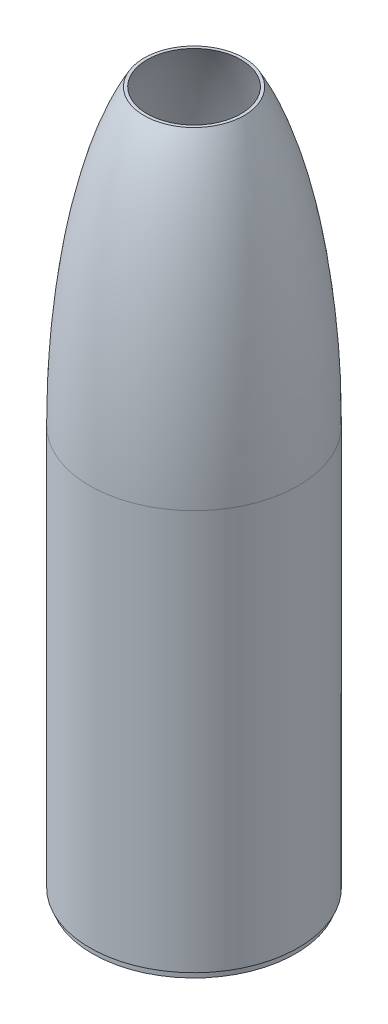
ISO-10303-21;
HEADER;
FILE_DESCRIPTION(('STEP AP214'),'2;1');
FILE_NAME('part.step','',(''),(''),'','','');
FILE_SCHEMA(('AUTOMOTIVE_DESIGN { 1 0 10303 214 1 1 1 1 }'));
ENDSEC;
DATA;
#1=APPLICATION_CONTEXT('core data for automotive mechanical design processes');
#2=APPLICATION_PROTOCOL_DEFINITION('international standard','automotive_design',2000,#1);
#3=PRODUCT_CONTEXT('',#1,'mechanical');
#4=PRODUCT('Part','Part','',(#3));
#5=PRODUCT_RELATED_PRODUCT_CATEGORY('part','',(#4));
#6=PRODUCT_DEFINITION_FORMATION('','',#4);
#7=PRODUCT_DEFINITION_CONTEXT('part definition',#1,'design');
#8=PRODUCT_DEFINITION('design','',#6,#7);
#9=PRODUCT_DEFINITION_SHAPE('','',#8);
#10=(LENGTH_UNIT() NAMED_UNIT(*) SI_UNIT(.MILLI.,.METRE.));
#11=(NAMED_UNIT(*) PLANE_ANGLE_UNIT() SI_UNIT($,.RADIAN.));
#12=(NAMED_UNIT(*) SI_UNIT($,.STERADIAN.) SOLID_ANGLE_UNIT());
#13=UNCERTAINTY_MEASURE_WITH_UNIT(LENGTH_MEASURE(1.E-05),#10,'distance_accuracy_value','');
#14=(GEOMETRIC_REPRESENTATION_CONTEXT(3) GLOBAL_UNCERTAINTY_ASSIGNED_CONTEXT((#13)) GLOBAL_UNIT_ASSIGNED_CONTEXT((#10,
#11,#12)) REPRESENTATION_CONTEXT('',''));
#15=CARTESIAN_POINT('',(0.,0.,0.));
#16=DIRECTION('',(0.,0.,1.));
#17=DIRECTION('',(1.,0.,0.));
#18=AXIS2_PLACEMENT_3D('',#15,#16,#17);
#19=CARTESIAN_POINT('',(78.16,300.,0.));
#20=CARTESIAN_POINT('',(78.16,308.124741440831,0.));
#21=CARTESIAN_POINT('',(77.9143964283696,324.415956202879,0.));
#22=CARTESIAN_POINT('',(76.8126900292029,348.585734280331,0.));
#23=CARTESIAN_POINT('',(74.987978239891,372.299614595278,0.));
#24=CARTESIAN_POINT('',(71.6143857103054,402.993821618781,0.));
#25=CARTESIAN_POINT('',(65.6897649255414,439.080732547851,0.));
#26=CARTESIAN_POINT('',(56.1093429123413,477.087146411559,0.));
#27=CARTESIAN_POINT('',(44.4035725024656,508.368758891952,0.));
#28=CARTESIAN_POINT('',(33.2071437767828,527.875372885673,0.));
#29=CARTESIAN_POINT('',(23.5506825278786,539.130576689322,0.));
#30=CARTESIAN_POINT('',(15.9852093641942,545.313409978409,0.));
#31=CARTESIAN_POINT('',(8.09536320832361,549.131102802521,0.));
#32=CARTESIAN_POINT('',(2.72314978418836,550.,0.));
#33=CARTESIAN_POINT('',(0.,550.,0.));
#34=B_SPLINE_CURVE_WITH_KNOTS('',3,(#19,#20,#21,#22,#23,#24,#25,#26,#27,#28,#29,#30,#31,#32,
#33),.UNSPECIFIED.,.F.,.F.,(4,1,1,1,1,1,1,1,1,1,1,1,4),(-1.5707963267949,-1.47262155637022,
-1.37444678594553,-1.27627201552085,-1.17809724509617,-0.98174770424681,-0.785398163397448,
-0.589048622548086,-0.392699081698724,-0.294524311274043,-0.196349540849362,-0.0981747704246811,
0.),.UNSPECIFIED.);
#35=CARTESIAN_POINT('',(0.,0.,0.));
#36=DIRECTION('',(0.,-1.,0.));
#37=AXIS1_PLACEMENT('',#35,#36);
#38=SURFACE_OF_REVOLUTION('',#34,#37);
#39=CARTESIAN_POINT('',(0.,520.,0.));
#40=DIRECTION('',(0.,-1.,0.));
#41=DIRECTION('',(0.,0.,-1.));
#42=AXIS2_PLACEMENT_3D('',#39,#40,#41);
#43=CIRCLE('',#42,37.4634477047783);
#44=CARTESIAN_POINT('',(0.,520.,-37.4634477047783));
#45=VERTEX_POINT('',#44);
#46=EDGE_CURVE('E103',#45,#45,#43,.F.);
#47=ORIENTED_EDGE('',*,*,#46,.F.);
#48=EDGE_LOOP('',(#47));
#49=FACE_BOUND('',#48,.T.);
#50=CARTESIAN_POINT('',(0.,300.,0.));
#51=DIRECTION('',(0.,-1.,0.));
#52=DIRECTION('',(0.,0.,-1.));
#53=AXIS2_PLACEMENT_3D('',#50,#51,#52);
#54=CIRCLE('',#53,78.16);
#55=CARTESIAN_POINT('',(0.,300.,-78.16));
#56=VERTEX_POINT('',#55);
#57=EDGE_CURVE('E51',#56,#56,#54,.T.);
#58=ORIENTED_EDGE('',*,*,#57,.F.);
#59=EDGE_LOOP('',(#58));
#60=FACE_BOUND('',#59,.T.);
#61=ADVANCED_FACE('F37',(#49,#60),#38,.F.);
#62=CARTESIAN_POINT('',(76.2,0.,0.));
#63=DIRECTION('',(0.,-1.,0.));
#64=DIRECTION('',(0.,0.,-1.));
#65=AXIS2_PLACEMENT_3D('',#62,#63,#64);
#66=PLANE('',#65);
#67=CARTESIAN_POINT('',(0.,0.,0.));
#68=DIRECTION('',(0.,-1.,0.));
#69=DIRECTION('',(0.,0.,-1.));
#70=AXIS2_PLACEMENT_3D('',#67,#68,#69);
#71=CIRCLE('',#70,78.16);
#72=CARTESIAN_POINT('',(0.,0.,-78.16));
#73=VERTEX_POINT('',#72);
#74=EDGE_CURVE('E46',#73,#73,#71,.T.);
#75=ORIENTED_EDGE('',*,*,#74,.T.);
#76=EDGE_LOOP('',(#75));
#77=FACE_BOUND('',#76,.T.);
#78=CARTESIAN_POINT('',(0.,0.,0.));
#79=DIRECTION('',(0.,-1.,0.));
#80=DIRECTION('',(0.,0.,-1.));
#81=AXIS2_PLACEMENT_3D('',#78,#79,#80);
#82=CIRCLE('',#81,76.2);
#83=CARTESIAN_POINT('',(0.,0.,76.2));
#84=VERTEX_POINT('',#83);
#85=EDGE_CURVE('E10',#84,#84,#82,.T.);
#86=ORIENTED_EDGE('',*,*,#85,.F.);
#87=EDGE_LOOP('',(#86));
#88=FACE_BOUND('',#87,.T.);
#89=ADVANCED_FACE('F69',(#77,#88),#66,.T.);
#90=CARTESIAN_POINT('',(0.,0.,0.));
#91=DIRECTION('',(0.,-1.,0.));
#92=DIRECTION('',(0.,0.,-1.));
#93=AXIS2_PLACEMENT_3D('',#90,#91,#92);
#94=CYLINDRICAL_SURFACE('',#93,78.16);
#95=ORIENTED_EDGE('',*,*,#57,.T.);
#96=EDGE_LOOP('',(#95));
#97=FACE_BOUND('',#96,.T.);
#98=ORIENTED_EDGE('',*,*,#74,.F.);
#99=EDGE_LOOP('',(#98));
#100=FACE_BOUND('',#99,.T.);
#101=ADVANCED_FACE('F72',(#97,#100),#94,.T.);
#102=CARTESIAN_POINT('',(0.,-4.80000000000003,0.));
#103=DIRECTION('',(0.,1.,0.));
#104=DIRECTION('',(0.,0.,1.));
#105=AXIS2_PLACEMENT_3D('',#102,#103,#104);
#106=CYLINDRICAL_SURFACE('',#105,76.2);
#107=CARTESIAN_POINT('',(0.,-4.80000000000003,0.));
#108=DIRECTION('',(0.,1.,0.));
#109=DIRECTION('',(0.,0.,1.));
#110=AXIS2_PLACEMENT_3D('',#107,#108,#109);
#111=CIRCLE('',#110,76.2);
#112=CARTESIAN_POINT('',(0.,-4.80000000000003,76.2));
#113=VERTEX_POINT('',#112);
#114=EDGE_CURVE('E57',#113,#113,#111,.T.);
#115=CARTESIAN_POINT('',(0.,0.,76.2));
#116=CARTESIAN_POINT('',(0.,-0.0499999999999994,76.2));
#117=CARTESIAN_POINT('',(0.,-0.0999999999999997,76.2));
#118=CARTESIAN_POINT('',(0.,-0.2,76.2));
#119=CARTESIAN_POINT('',(0.,-0.25,76.2));
#120=CARTESIAN_POINT('',(0.,-0.350000000000001,76.2));
#121=CARTESIAN_POINT('',(0.,-0.400000000000001,76.2));
#122=CARTESIAN_POINT('',(0.,-0.500000000000002,76.2));
#123=CARTESIAN_POINT('',(0.,-0.550000000000002,76.2));
#124=CARTESIAN_POINT('',(0.,-0.650000000000003,76.2));
#125=CARTESIAN_POINT('',(0.,-0.700000000000003,76.2));
#126=CARTESIAN_POINT('',(0.,-0.800000000000003,76.2));
#127=CARTESIAN_POINT('',(0.,-0.850000000000004,76.2));
#128=CARTESIAN_POINT('',(0.,-0.950000000000004,76.2));
#129=CARTESIAN_POINT('',(0.,-1.,76.2));
#130=CARTESIAN_POINT('',(0.,-1.10000000000001,76.2));
#131=CARTESIAN_POINT('',(0.,-1.15000000000001,76.2));
#132=CARTESIAN_POINT('',(0.,-1.25000000000001,76.2));
#133=CARTESIAN_POINT('',(0.,-1.30000000000001,76.2));
#134=CARTESIAN_POINT('',(0.,-1.40000000000001,76.2));
#135=CARTESIAN_POINT('',(0.,-1.45000000000001,76.2));
#136=CARTESIAN_POINT('',(0.,-1.55000000000001,76.2));
#137=CARTESIAN_POINT('',(0.,-1.60000000000001,76.2));
#138=CARTESIAN_POINT('',(0.,-1.70000000000001,76.2));
#139=CARTESIAN_POINT('',(0.,-1.75000000000001,76.2));
#140=CARTESIAN_POINT('',(0.,-1.85000000000001,76.2));
#141=CARTESIAN_POINT('',(0.,-1.90000000000001,76.2));
#142=CARTESIAN_POINT('',(0.,-2.00000000000001,76.2));
#143=CARTESIAN_POINT('',(0.,-2.05000000000001,76.2));
#144=CARTESIAN_POINT('',(0.,-2.15000000000001,76.2));
#145=CARTESIAN_POINT('',(0.,-2.20000000000001,76.2));
#146=CARTESIAN_POINT('',(0.,-2.30000000000001,76.2));
#147=CARTESIAN_POINT('',(0.,-2.35000000000001,76.2));
#148=CARTESIAN_POINT('',(0.,-2.45000000000001,76.2));
#149=CARTESIAN_POINT('',(0.,-2.50000000000001,76.2));
#150=CARTESIAN_POINT('',(0.,-2.60000000000001,76.2));
#151=CARTESIAN_POINT('',(0.,-2.65000000000001,76.2));
#152=CARTESIAN_POINT('',(0.,-2.75000000000001,76.2));
#153=CARTESIAN_POINT('',(0.,-2.80000000000001,76.2));
#154=CARTESIAN_POINT('',(0.,-2.90000000000002,76.2));
#155=CARTESIAN_POINT('',(0.,-2.95000000000002,76.2));
#156=CARTESIAN_POINT('',(0.,-3.05000000000002,76.2));
#157=CARTESIAN_POINT('',(0.,-3.10000000000002,76.2));
#158=CARTESIAN_POINT('',(0.,-3.20000000000002,76.2));
#159=CARTESIAN_POINT('',(0.,-3.25000000000002,76.2));
#160=CARTESIAN_POINT('',(0.,-3.35000000000002,76.2));
#161=CARTESIAN_POINT('',(0.,-3.40000000000002,76.2));
#162=CARTESIAN_POINT('',(0.,-3.50000000000002,76.2));
#163=CARTESIAN_POINT('',(0.,-3.55000000000002,76.2));
#164=CARTESIAN_POINT('',(0.,-3.65000000000002,76.2));
#165=CARTESIAN_POINT('',(0.,-3.70000000000002,76.2));
#166=CARTESIAN_POINT('',(0.,-3.80000000000002,76.2));
#167=CARTESIAN_POINT('',(0.,-3.85000000000002,76.2));
#168=CARTESIAN_POINT('',(0.,-3.95000000000002,76.2));
#169=CARTESIAN_POINT('',(0.,-4.00000000000002,76.2));
#170=CARTESIAN_POINT('',(0.,-4.10000000000002,76.2));
#171=CARTESIAN_POINT('',(0.,-4.15000000000002,76.2));
#172=CARTESIAN_POINT('',(0.,-4.25000000000002,76.2));
#173=CARTESIAN_POINT('',(0.,-4.30000000000002,76.2));
#174=CARTESIAN_POINT('',(0.,-4.40000000000002,76.2));
#175=CARTESIAN_POINT('',(0.,-4.45000000000002,76.2));
#176=CARTESIAN_POINT('',(0.,-4.55000000000003,76.2));
#177=CARTESIAN_POINT('',(0.,-4.60000000000003,76.2));
#178=CARTESIAN_POINT('',(0.,-4.70000000000003,76.2));
#179=CARTESIAN_POINT('',(0.,-4.75000000000003,76.2));
#180=CARTESIAN_POINT('',(0.,-4.80000000000003,76.2));
#181=B_SPLINE_CURVE_WITH_KNOTS('',3,(#115,#116,#117,#118,#119,#120,#121,#122,#123,#124,#125,
#126,#127,#128,#129,#130,#131,#132,#133,#134,#135,#136,#137,#138,#139,#140,#141,#142,#143,#144,
#145,#146,#147,#148,#149,#150,#151,#152,#153,#154,#155,#156,#157,#158,#159,#160,#161,#162,#163,
#164,#165,#166,#167,#168,#169,#170,#171,#172,#173,#174,#175,#176,#177,#178,#179,#180),
.UNSPECIFIED.,.F.,.F.,(4,2,2,2,2,2,2,2,2,2,2,2,2,2,2,2,2,2,2,2,2,2,2,2,2,2,2,2,2,2,2,2,4),(0.,
0.150000000000001,0.300000000000002,0.450000000000003,0.600000000000003,0.750000000000004,
0.900000000000005,1.05000000000001,1.20000000000001,1.35000000000001,1.50000000000001,
1.65000000000001,1.80000000000001,1.95000000000001,2.10000000000001,2.25000000000001,
2.40000000000001,2.55000000000001,2.70000000000002,2.85000000000002,3.00000000000002,
3.15000000000002,3.30000000000002,3.45000000000002,3.60000000000002,3.75000000000002,
3.90000000000002,4.05000000000002,4.20000000000002,4.35000000000002,4.50000000000003,
4.65000000000003,4.80000000000003),.UNSPECIFIED.);
#182=EDGE_CURVE('BSEAM76',#84,#113,#181,.T.);
#183=ORIENTED_EDGE('',*,*,#85,.T.);
#184=ORIENTED_EDGE('',*,*,#114,.T.);
#185=ORIENTED_EDGE('',*,*,#182,.T.);
#186=ORIENTED_EDGE('',*,*,#182,.F.);
#187=EDGE_LOOP('',(#183,#185,#184,#186));
#188=FACE_BOUND('',#187,.T.);
#189=ADVANCED_FACE('F76',(#188),#106,.T.);
#190=CARTESIAN_POINT('',(0.,-4.80000000000003,0.));
#191=DIRECTION('',(0.,1.,0.));
#192=DIRECTION('',(0.,0.,1.));
#193=AXIS2_PLACEMENT_3D('',#190,#191,#192);
#194=PLANE('',#193);
#195=CARTESIAN_POINT('',(0.,-4.80000000000003,0.));
#196=DIRECTION('',(0.,1.,0.));
#197=DIRECTION('',(0.,0.,1.));
#198=AXIS2_PLACEMENT_3D('',#195,#196,#197);
#199=CIRCLE('',#198,74.2);
#200=CARTESIAN_POINT('',(0.,-4.80000000000003,74.2));
#201=VERTEX_POINT('',#200);
#202=EDGE_CURVE('E114',#201,#201,#199,.T.);
#203=ORIENTED_EDGE('',*,*,#202,.T.);
#204=EDGE_LOOP('',(#203));
#205=FACE_BOUND('',#204,.T.);
#206=ORIENTED_EDGE('',*,*,#114,.F.);
#207=EDGE_LOOP('',(#206));
#208=FACE_BOUND('',#207,.T.);
#209=ADVANCED_FACE('F80',(#205,#208),#194,.F.);
#210=CARTESIAN_POINT('',(0.,300.,0.));
#211=DIRECTION('',(0.,1.,0.));
#212=DIRECTION('',(0.,0.,1.));
#213=AXIS2_PLACEMENT_3D('',#210,#211,#212);
#214=PLANE('',#213);
#215=CARTESIAN_POINT('',(0.,300.,0.));
#216=DIRECTION('',(0.,1.,0.));
#217=DIRECTION('',(0.,0.,1.));
#218=AXIS2_PLACEMENT_3D('',#215,#216,#217);
#219=CIRCLE('',#218,74.2);
#220=CARTESIAN_POINT('',(0.,300.,74.2));
#221=VERTEX_POINT('',#220);
#222=EDGE_CURVE('E109',#221,#221,#219,.T.);
#223=ORIENTED_EDGE('',*,*,#222,.F.);
#224=EDGE_LOOP('',(#223));
#225=FACE_BOUND('',#224,.T.);
#226=CARTESIAN_POINT('',(0.,300.,0.));
#227=DIRECTION('',(0.,1.,0.));
#228=DIRECTION('',(0.,0.,1.));
#229=AXIS2_PLACEMENT_3D('',#226,#227,#228);
#230=CIRCLE('',#229,76.2);
#231=CARTESIAN_POINT('',(0.,300.,76.2));
#232=VERTEX_POINT('',#231);
#233=EDGE_CURVE('E120',#232,#232,#230,.T.);
#234=ORIENTED_EDGE('',*,*,#233,.T.);
#235=EDGE_LOOP('',(#234));
#236=FACE_BOUND('',#235,.T.);
#237=ADVANCED_FACE('F81',(#225,#236),#214,.T.);
#238=CARTESIAN_POINT('',(0.,-4.80000000000003,0.));
#239=DIRECTION('',(0.,1.,0.));
#240=DIRECTION('',(0.,0.,1.));
#241=AXIS2_PLACEMENT_3D('',#238,#239,#240);
#242=CYLINDRICAL_SURFACE('',#241,74.2);
#243=CARTESIAN_POINT('',(0.,-4.80000000000003,74.2));
#244=CARTESIAN_POINT('',(0.,-1.62500000000003,74.2));
#245=CARTESIAN_POINT('',(0.,1.54999999999997,74.2));
#246=CARTESIAN_POINT('',(0.,7.89999999999997,74.2));
#247=CARTESIAN_POINT('',(0.,11.075,74.2));
#248=CARTESIAN_POINT('',(0.,17.425,74.2));
#249=CARTESIAN_POINT('',(0.,20.6,74.2));
#250=CARTESIAN_POINT('',(0.,26.95,74.2));
#251=CARTESIAN_POINT('',(0.,30.125,74.2));
#252=CARTESIAN_POINT('',(0.,36.475,74.2));
#253=CARTESIAN_POINT('',(0.,39.65,74.2));
#254=CARTESIAN_POINT('',(0.,46.,74.2));
#255=CARTESIAN_POINT('',(0.,49.175,74.2));
#256=CARTESIAN_POINT('',(0.,55.525,74.2));
#257=CARTESIAN_POINT('',(0.,58.7,74.2));
#258=CARTESIAN_POINT('',(0.,65.05,74.2));
#259=CARTESIAN_POINT('',(0.,68.225,74.2));
#260=CARTESIAN_POINT('',(0.,74.575,74.2));
#261=CARTESIAN_POINT('',(0.,77.75,74.2));
#262=CARTESIAN_POINT('',(0.,84.1,74.2));
#263=CARTESIAN_POINT('',(0.,87.275,74.2));
#264=CARTESIAN_POINT('',(0.,93.625,74.2));
#265=CARTESIAN_POINT('',(0.,96.8,74.2));
#266=CARTESIAN_POINT('',(0.,103.15,74.2));
#267=CARTESIAN_POINT('',(0.,106.325,74.2));
#268=CARTESIAN_POINT('',(0.,112.675,74.2));
#269=CARTESIAN_POINT('',(0.,115.85,74.2));
#270=CARTESIAN_POINT('',(0.,122.2,74.2));
#271=CARTESIAN_POINT('',(0.,125.375,74.2));
#272=CARTESIAN_POINT('',(0.,131.725,74.2));
#273=CARTESIAN_POINT('',(0.,134.9,74.2));
#274=CARTESIAN_POINT('',(0.,141.25,74.2));
#275=CARTESIAN_POINT('',(0.,144.425,74.2));
#276=CARTESIAN_POINT('',(0.,150.775,74.2));
#277=CARTESIAN_POINT('',(0.,153.95,74.2));
#278=CARTESIAN_POINT('',(0.,160.3,74.2));
#279=CARTESIAN_POINT('',(0.,163.475,74.2));
#280=CARTESIAN_POINT('',(0.,169.825,74.2));
#281=CARTESIAN_POINT('',(0.,173.,74.2));
#282=CARTESIAN_POINT('',(0.,179.35,74.2));
#283=CARTESIAN_POINT('',(0.,182.525,74.2));
#284=CARTESIAN_POINT('',(0.,188.875,74.2));
#285=CARTESIAN_POINT('',(0.,192.05,74.2));
#286=CARTESIAN_POINT('',(0.,198.4,74.2));
#287=CARTESIAN_POINT('',(0.,201.575,74.2));
#288=CARTESIAN_POINT('',(0.,207.925,74.2));
#289=CARTESIAN_POINT('',(0.,211.1,74.2));
#290=CARTESIAN_POINT('',(0.,217.45,74.2));
#291=CARTESIAN_POINT('',(0.,220.625,74.2));
#292=CARTESIAN_POINT('',(0.,226.975,74.2));
#293=CARTESIAN_POINT('',(0.,230.15,74.2));
#294=CARTESIAN_POINT('',(0.,236.5,74.2));
#295=CARTESIAN_POINT('',(0.,239.675,74.2));
#296=CARTESIAN_POINT('',(0.,246.025,74.2));
#297=CARTESIAN_POINT('',(0.,249.2,74.2));
#298=CARTESIAN_POINT('',(0.,255.55,74.2));
#299=CARTESIAN_POINT('',(0.,258.725,74.2));
#300=CARTESIAN_POINT('',(0.,265.075,74.2));
#301=CARTESIAN_POINT('',(0.,268.25,74.2));
#302=CARTESIAN_POINT('',(0.,274.6,74.2));
#303=CARTESIAN_POINT('',(0.,277.775,74.2));
#304=CARTESIAN_POINT('',(0.,284.125,74.2));
#305=CARTESIAN_POINT('',(0.,287.3,74.2));
#306=CARTESIAN_POINT('',(0.,293.65,74.2));
#307=CARTESIAN_POINT('',(0.,296.825,74.2));
#308=CARTESIAN_POINT('',(0.,300.,74.2));
#309=B_SPLINE_CURVE_WITH_KNOTS('',3,(#243,#244,#245,#246,#247,#248,#249,#250,#251,#252,#253,
#254,#255,#256,#257,#258,#259,#260,#261,#262,#263,#264,#265,#266,#267,#268,#269,#270,#271,#272,
#273,#274,#275,#276,#277,#278,#279,#280,#281,#282,#283,#284,#285,#286,#287,#288,#289,#290,#291,
#292,#293,#294,#295,#296,#297,#298,#299,#300,#301,#302,#303,#304,#305,#306,#307,#308),
.UNSPECIFIED.,.F.,.F.,(4,2,2,2,2,2,2,2,2,2,2,2,2,2,2,2,2,2,2,2,2,2,2,2,2,2,2,2,2,2,2,2,4),(0.,
9.525,19.05,28.575,38.1,47.625,57.15,66.675,76.2,85.725,95.25,104.775,114.3,123.825,133.35,
142.875,152.4,161.925,171.45,180.975,190.5,200.025,209.55,219.075,228.6,238.125,247.65,257.175,
266.7,276.225,285.75,295.275,304.8),.UNSPECIFIED.);
#310=EDGE_CURVE('BSEAM67',#201,#221,#309,.T.);
#311=ORIENTED_EDGE('',*,*,#202,.F.);
#312=ORIENTED_EDGE('',*,*,#222,.T.);
#313=ORIENTED_EDGE('',*,*,#310,.T.);
#314=ORIENTED_EDGE('',*,*,#310,.F.);
#315=EDGE_LOOP('',(#311,#313,#312,#314));
#316=FACE_BOUND('',#315,.T.);
#317=ADVANCED_FACE('F67',(#316),#242,.F.);
#318=CARTESIAN_POINT('',(0.,300.,0.));
#319=DIRECTION('',(0.,0.,-1.));
#320=DIRECTION('',(0.,1.,0.));
#321=AXIS2_PLACEMENT_3D('',#318,#319,#320);
#322=ELLIPSE('',#321,248.04,76.2);
#323=TRIMMED_CURVE('',#322,(PARAMETER_VALUE(0.)),(PARAMETER_VALUE(3.14159265358979)),.T.,.PARAMETER.);
#324=CARTESIAN_POINT('',(0.,0.,0.));
#325=DIRECTION('',(0.,-1.,0.));
#326=AXIS1_PLACEMENT('',#324,#325);
#327=SURFACE_OF_REVOLUTION('',#323,#326);
#328=CARTESIAN_POINT('',(0.,520.,0.));
#329=DIRECTION('',(0.,-1.,0.));
#330=DIRECTION('',(0.,0.,-1.));
#331=AXIS2_PLACEMENT_3D('',#328,#329,#330);
#332=CIRCLE('',#331,35.1936036452897);
#333=CARTESIAN_POINT('',(0.,520.,-35.1936036452897));
#334=VERTEX_POINT('',#333);
#335=EDGE_CURVE('E41',#334,#334,#332,.T.);
#336=ORIENTED_EDGE('',*,*,#335,.F.);
#337=EDGE_LOOP('',(#336));
#338=FACE_BOUND('',#337,.T.);
#339=ORIENTED_EDGE('',*,*,#233,.F.);
#340=EDGE_LOOP('',(#339));
#341=FACE_BOUND('',#340,.T.);
#342=ADVANCED_FACE('F63',(#338,#341),#327,.F.);
#343=CARTESIAN_POINT('',(0.,520.,0.));
#344=DIRECTION('',(0.,-1.,0.));
#345=DIRECTION('',(0.,0.,-1.));
#346=AXIS2_PLACEMENT_3D('',#343,#344,#345);
#347=PLANE('',#346);
#348=ORIENTED_EDGE('',*,*,#46,.T.);
#349=EDGE_LOOP('',(#348));
#350=FACE_BOUND('',#349,.T.);
#351=ORIENTED_EDGE('',*,*,#335,.T.);
#352=EDGE_LOOP('',(#351));
#353=FACE_BOUND('',#352,.T.);
#354=ADVANCED_FACE('F66',(#350,#353),#347,.F.);
#355=CLOSED_SHELL('',(#61,#89,#101,#189,#209,#237,#317,#342,#354));
#356=MANIFOLD_SOLID_BREP('B2',#355);
#357=ADVANCED_BREP_SHAPE_REPRESENTATION('',(#18,#356),#14);
#358=SHAPE_DEFINITION_REPRESENTATION(#9,#357);
ENDSEC;
END-ISO-10303-21;
